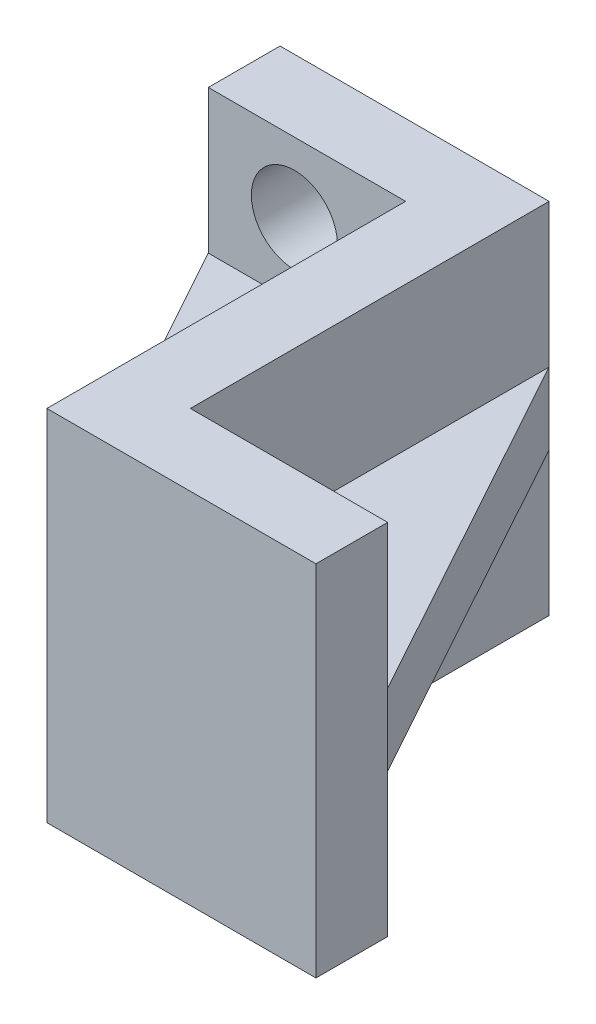
ISO-10303-21;
HEADER;
FILE_DESCRIPTION(('STEP AP214'),'2;1');
FILE_NAME('part.step','',(''),(''),'','','');
FILE_SCHEMA(('AUTOMOTIVE_DESIGN { 1 0 10303 214 1 1 1 1 }'));
ENDSEC;
DATA;
#1=APPLICATION_CONTEXT('core data for automotive mechanical design processes');
#2=APPLICATION_PROTOCOL_DEFINITION('international standard','automotive_design',2000,#1);
#3=PRODUCT_CONTEXT('',#1,'mechanical');
#4=PRODUCT('Part','Part','',(#3));
#5=PRODUCT_RELATED_PRODUCT_CATEGORY('part','',(#4));
#6=PRODUCT_DEFINITION_FORMATION('','',#4);
#7=PRODUCT_DEFINITION_CONTEXT('part definition',#1,'design');
#8=PRODUCT_DEFINITION('design','',#6,#7);
#9=PRODUCT_DEFINITION_SHAPE('','',#8);
#10=(LENGTH_UNIT() NAMED_UNIT(*) SI_UNIT(.MILLI.,.METRE.));
#11=(NAMED_UNIT(*) PLANE_ANGLE_UNIT() SI_UNIT($,.RADIAN.));
#12=(NAMED_UNIT(*) SI_UNIT($,.STERADIAN.) SOLID_ANGLE_UNIT());
#13=UNCERTAINTY_MEASURE_WITH_UNIT(LENGTH_MEASURE(1.E-05),#10,'distance_accuracy_value','');
#14=(GEOMETRIC_REPRESENTATION_CONTEXT(3) GLOBAL_UNCERTAINTY_ASSIGNED_CONTEXT((#13)) GLOBAL_UNIT_ASSIGNED_CONTEXT((#10,
#11,#12)) REPRESENTATION_CONTEXT('',''));
#15=CARTESIAN_POINT('',(0.,0.,0.));
#16=DIRECTION('',(0.,0.,1.));
#17=DIRECTION('',(1.,0.,0.));
#18=AXIS2_PLACEMENT_3D('',#15,#16,#17);
#19=CARTESIAN_POINT('',(-20.,0.,0.));
#20=DIRECTION('',(1.,0.,0.));
#21=DIRECTION('',(0.,0.,-1.));
#22=AXIS2_PLACEMENT_3D('',#19,#20,#21);
#23=PLANE('',#22);
#24=DIRECTION('',(0.,0.,1.));
#25=VECTOR('',#24,1.);
#26=CARTESIAN_POINT('',(-20.,-20.,0.));
#27=LINE('',#26,#25);
#28=CARTESIAN_POINT('',(-20.,-20.,-80.));
#29=VERTEX_POINT('',#28);
#30=CARTESIAN_POINT('',(-20.,-20.,120.));
#31=VERTEX_POINT('',#30);
#32=EDGE_CURVE('E141',#29,#31,#27,.T.);
#33=ORIENTED_EDGE('',*,*,#32,.F.);
#34=DIRECTION('',(0.,1.,0.));
#35=VECTOR('',#34,1.);
#36=CARTESIAN_POINT('',(-20.,100.,-80.));
#37=LINE('',#36,#35);
#38=CARTESIAN_POINT('',(-20.,-100.,-80.));
#39=VERTEX_POINT('',#38);
#40=EDGE_CURVE('E199',#39,#29,#37,.T.);
#41=ORIENTED_EDGE('',*,*,#40,.F.);
#42=DIRECTION('',(0.,0.,-1.));
#43=VECTOR('',#42,1.);
#44=CARTESIAN_POINT('',(-20.,-100.,120.));
#45=LINE('',#44,#43);
#46=CARTESIAN_POINT('',(-20.,-100.,120.));
#47=VERTEX_POINT('',#46);
#48=EDGE_CURVE('E161',#47,#39,#45,.T.);
#49=ORIENTED_EDGE('',*,*,#48,.F.);
#50=DIRECTION('',(0.,-1.,0.));
#51=VECTOR('',#50,1.);
#52=CARTESIAN_POINT('',(-20.,-100.,120.));
#53=LINE('',#52,#51);
#54=EDGE_CURVE('E159',#31,#47,#53,.T.);
#55=ORIENTED_EDGE('',*,*,#54,.F.);
#56=EDGE_LOOP('',(#33,#41,#49,#55));
#57=FACE_BOUND('',#56,.T.);
#58=ADVANCED_FACE('F39',(#57),#23,.F.);
#59=CARTESIAN_POINT('',(-130.,100.,-80.));
#60=DIRECTION('',(0.,0.,-1.));
#61=DIRECTION('',(-1.,0.,0.));
#62=AXIS2_PLACEMENT_3D('',#59,#60,#61);
#63=PLANE('',#62);
#64=CARTESIAN_POINT('',(-82.,-60.,-80.));
#65=DIRECTION('',(0.,0.,-1.));
#66=DIRECTION('',(-1.,0.,0.));
#67=AXIS2_PLACEMENT_3D('',#64,#65,#66);
#68=CIRCLE('',#67,24.);
#69=CARTESIAN_POINT('',(-106.,-60.,-80.));
#70=VERTEX_POINT('',#69);
#71=EDGE_CURVE('E156',#70,#70,#68,.T.);
#72=ORIENTED_EDGE('',*,*,#71,.T.);
#73=EDGE_LOOP('',(#72));
#74=FACE_BOUND('',#73,.T.);
#75=DIRECTION('',(1.,0.,0.));
#76=VECTOR('',#75,1.);
#77=CARTESIAN_POINT('',(-130.,-20.,-80.));
#78=LINE('',#77,#76);
#79=CARTESIAN_POINT('',(-130.,-20.,-80.));
#80=VERTEX_POINT('',#79);
#81=EDGE_CURVE('E146',#80,#29,#78,.T.);
#82=ORIENTED_EDGE('',*,*,#81,.F.);
#83=DIRECTION('',(0.,1.,0.));
#84=VECTOR('',#83,1.);
#85=CARTESIAN_POINT('',(-130.,100.,-80.));
#86=LINE('',#85,#84);
#87=CARTESIAN_POINT('',(-130.,-100.,-80.));
#88=VERTEX_POINT('',#87);
#89=EDGE_CURVE('E204',#88,#80,#86,.T.);
#90=ORIENTED_EDGE('',*,*,#89,.F.);
#91=DIRECTION('',(1.,0.,0.));
#92=VECTOR('',#91,1.);
#93=CARTESIAN_POINT('',(-130.,-100.,-80.));
#94=LINE('',#93,#92);
#95=EDGE_CURVE('E211',#88,#39,#94,.T.);
#96=ORIENTED_EDGE('',*,*,#95,.T.);
#97=ORIENTED_EDGE('',*,*,#40,.T.);
#98=EDGE_LOOP('',(#82,#90,#96,#97));
#99=FACE_BOUND('',#98,.T.);
#100=ADVANCED_FACE('F309',(#74,#99),#63,.F.);
#101=CARTESIAN_POINT('',(20.,0.,0.));
#102=DIRECTION('',(1.,0.,0.));
#103=DIRECTION('',(0.,0.,-1.));
#104=AXIS2_PLACEMENT_3D('',#101,#102,#103);
#105=PLANE('',#104);
#106=DIRECTION('',(0.,1.,0.));
#107=VECTOR('',#106,1.);
#108=CARTESIAN_POINT('',(20.,-100.,-120.));
#109=LINE('',#108,#107);
#110=CARTESIAN_POINT('',(20.,-100.,-120.));
#111=VERTEX_POINT('',#110);
#112=CARTESIAN_POINT('',(20.,-20.,-120.));
#113=VERTEX_POINT('',#112);
#114=EDGE_CURVE('E243',#111,#113,#109,.T.);
#115=ORIENTED_EDGE('',*,*,#114,.T.);
#116=DIRECTION('',(0.,0.,1.));
#117=VECTOR('',#116,1.);
#118=CARTESIAN_POINT('',(20.,-20.,0.));
#119=LINE('',#118,#117);
#120=CARTESIAN_POINT('',(20.,-20.,80.));
#121=VERTEX_POINT('',#120);
#122=EDGE_CURVE('E181',#113,#121,#119,.T.);
#123=ORIENTED_EDGE('',*,*,#122,.T.);
#124=DIRECTION('',(0.,1.,0.));
#125=VECTOR('',#124,1.);
#126=CARTESIAN_POINT('',(20.,-100.,80.));
#127=LINE('',#126,#125);
#128=CARTESIAN_POINT('',(20.,-100.,80.));
#129=VERTEX_POINT('',#128);
#130=EDGE_CURVE('E219',#129,#121,#127,.T.);
#131=ORIENTED_EDGE('',*,*,#130,.F.);
#132=DIRECTION('',(0.,0.,-1.));
#133=VECTOR('',#132,1.);
#134=CARTESIAN_POINT('',(20.,-100.,120.));
#135=LINE('',#134,#133);
#136=EDGE_CURVE('E240',#129,#111,#135,.T.);
#137=ORIENTED_EDGE('',*,*,#136,.T.);
#138=EDGE_LOOP('',(#115,#123,#131,#137));
#139=FACE_BOUND('',#138,.T.);
#140=ADVANCED_FACE('F316',(#139),#105,.T.);
#141=CARTESIAN_POINT('',(130.,-100.,80.));
#142=DIRECTION('',(0.,0.,1.));
#143=DIRECTION('',(1.,0.,0.));
#144=AXIS2_PLACEMENT_3D('',#141,#142,#143);
#145=PLANE('',#144);
#146=DIRECTION('',(-1.,0.,0.));
#147=VECTOR('',#146,1.);
#148=CARTESIAN_POINT('',(130.,-20.,80.));
#149=LINE('',#148,#147);
#150=CARTESIAN_POINT('',(130.,-20.,80.));
#151=VERTEX_POINT('',#150);
#152=EDGE_CURVE('E185',#151,#121,#149,.T.);
#153=ORIENTED_EDGE('',*,*,#152,.F.);
#154=DIRECTION('',(0.,1.,0.));
#155=VECTOR('',#154,1.);
#156=CARTESIAN_POINT('',(130.,-100.,80.));
#157=LINE('',#156,#155);
#158=CARTESIAN_POINT('',(130.,-100.,80.));
#159=VERTEX_POINT('',#158);
#160=EDGE_CURVE('E220',#159,#151,#157,.T.);
#161=ORIENTED_EDGE('',*,*,#160,.F.);
#162=DIRECTION('',(-1.,0.,0.));
#163=VECTOR('',#162,1.);
#164=CARTESIAN_POINT('',(130.,-100.,80.));
#165=LINE('',#164,#163);
#166=EDGE_CURVE('E234',#159,#129,#165,.T.);
#167=ORIENTED_EDGE('',*,*,#166,.T.);
#168=ORIENTED_EDGE('',*,*,#130,.T.);
#169=EDGE_LOOP('',(#153,#161,#167,#168));
#170=FACE_BOUND('',#169,.T.);
#171=ADVANCED_FACE('F321',(#170),#145,.F.);
#172=CARTESIAN_POINT('',(-20.,20.,-80.));
#173=VERTEX_POINT('',#172);
#174=CARTESIAN_POINT('',(-20.,100.,-80.));
#175=VERTEX_POINT('',#174);
#176=EDGE_CURVE('E194',#173,#175,#37,.T.);
#177=ORIENTED_EDGE('',*,*,#176,.F.);
#178=DIRECTION('',(0.,0.,1.));
#179=VECTOR('',#178,1.);
#180=CARTESIAN_POINT('',(-20.,20.,0.));
#181=LINE('',#180,#179);
#182=CARTESIAN_POINT('',(-20.,20.,120.));
#183=VERTEX_POINT('',#182);
#184=EDGE_CURVE('E177',#173,#183,#181,.T.);
#185=ORIENTED_EDGE('',*,*,#184,.T.);
#186=CARTESIAN_POINT('',(-20.,100.,120.));
#187=VERTEX_POINT('',#186);
#188=EDGE_CURVE('E165',#187,#183,#53,.T.);
#189=ORIENTED_EDGE('',*,*,#188,.F.);
#190=DIRECTION('',(0.,0.,1.));
#191=VECTOR('',#190,1.);
#192=CARTESIAN_POINT('',(-20.,100.,120.));
#193=LINE('',#192,#191);
#194=EDGE_CURVE('E166',#175,#187,#193,.T.);
#195=ORIENTED_EDGE('',*,*,#194,.F.);
#196=EDGE_LOOP('',(#177,#185,#189,#195));
#197=FACE_BOUND('',#196,.T.);
#198=ADVANCED_FACE('F273',(#197),#23,.F.);
#199=CARTESIAN_POINT('',(20.,100.,120.));
#200=DIRECTION('',(0.,-1.,0.));
#201=DIRECTION('',(0.,0.,-1.));
#202=AXIS2_PLACEMENT_3D('',#199,#200,#201);
#203=PLANE('',#202);
#204=DIRECTION('',(-1.,0.,0.));
#205=VECTOR('',#204,1.);
#206=CARTESIAN_POINT('',(20.,100.,-120.));
#207=LINE('',#206,#205);
#208=CARTESIAN_POINT('',(20.,100.,-120.));
#209=VERTEX_POINT('',#208);
#210=CARTESIAN_POINT('',(-130.,100.,-120.));
#211=VERTEX_POINT('',#210);
#212=EDGE_CURVE('E246',#209,#211,#207,.T.);
#213=ORIENTED_EDGE('',*,*,#212,.T.);
#214=DIRECTION('',(0.,0.,-1.));
#215=VECTOR('',#214,1.);
#216=CARTESIAN_POINT('',(-130.,100.,-120.));
#217=LINE('',#216,#215);
#218=CARTESIAN_POINT('',(-130.,100.,-80.));
#219=VERTEX_POINT('',#218);
#220=EDGE_CURVE('E195',#219,#211,#217,.T.);
#221=ORIENTED_EDGE('',*,*,#220,.F.);
#222=DIRECTION('',(1.,0.,0.));
#223=VECTOR('',#222,1.);
#224=CARTESIAN_POINT('',(-130.,100.,-80.));
#225=LINE('',#224,#223);
#226=EDGE_CURVE('E207',#219,#175,#225,.T.);
#227=ORIENTED_EDGE('',*,*,#226,.T.);
#228=ORIENTED_EDGE('',*,*,#194,.T.);
#229=DIRECTION('',(-1.,0.,0.));
#230=VECTOR('',#229,1.);
#231=CARTESIAN_POINT('',(20.,100.,120.));
#232=LINE('',#231,#230);
#233=CARTESIAN_POINT('',(130.,100.,120.));
#234=VERTEX_POINT('',#233);
#235=EDGE_CURVE('E11',#234,#187,#232,.T.);
#236=ORIENTED_EDGE('',*,*,#235,.F.);
#237=DIRECTION('',(0.,0.,1.));
#238=VECTOR('',#237,1.);
#239=CARTESIAN_POINT('',(130.,100.,120.));
#240=LINE('',#239,#238);
#241=CARTESIAN_POINT('',(130.,100.,80.));
#242=VERTEX_POINT('',#241);
#243=EDGE_CURVE('E223',#242,#234,#240,.T.);
#244=ORIENTED_EDGE('',*,*,#243,.F.);
#245=DIRECTION('',(-1.,0.,0.));
#246=VECTOR('',#245,1.);
#247=CARTESIAN_POINT('',(130.,100.,80.));
#248=LINE('',#247,#246);
#249=CARTESIAN_POINT('',(20.,100.,80.));
#250=VERTEX_POINT('',#249);
#251=EDGE_CURVE('E229',#242,#250,#248,.T.);
#252=ORIENTED_EDGE('',*,*,#251,.T.);
#253=DIRECTION('',(0.,0.,1.));
#254=VECTOR('',#253,1.);
#255=CARTESIAN_POINT('',(20.,100.,120.));
#256=LINE('',#255,#254);
#257=EDGE_CURVE('E237',#209,#250,#256,.T.);
#258=ORIENTED_EDGE('',*,*,#257,.F.);
#259=EDGE_LOOP('',(#213,#221,#227,#228,#236,#244,#252,#258));
#260=FACE_BOUND('',#259,.T.);
#261=ADVANCED_FACE('F41',(#260),#203,.F.);
#262=CARTESIAN_POINT('',(20.,-100.,120.));
#263=DIRECTION('',(0.,0.,-1.));
#264=DIRECTION('',(-1.,0.,0.));
#265=AXIS2_PLACEMENT_3D('',#262,#263,#264);
#266=PLANE('',#265);
#267=ORIENTED_EDGE('',*,*,#188,.T.);
#268=DIRECTION('',(0.,-1.,0.));
#269=VECTOR('',#268,1.);
#270=CARTESIAN_POINT('',(-20.,-100.,120.));
#271=LINE('',#270,#269);
#272=EDGE_CURVE('E153',#31,#183,#271,.F.);
#273=ORIENTED_EDGE('',*,*,#272,.F.);
#274=ORIENTED_EDGE('',*,*,#54,.T.);
#275=DIRECTION('',(-1.,0.,0.));
#276=VECTOR('',#275,1.);
#277=CARTESIAN_POINT('',(20.,-100.,120.));
#278=LINE('',#277,#276);
#279=CARTESIAN_POINT('',(130.,-100.,120.));
#280=VERTEX_POINT('',#279);
#281=EDGE_CURVE('E48',#280,#47,#278,.T.);
#282=ORIENTED_EDGE('',*,*,#281,.F.);
#283=DIRECTION('',(0.,-1.,0.));
#284=VECTOR('',#283,1.);
#285=CARTESIAN_POINT('',(130.,-100.,120.));
#286=LINE('',#285,#284);
#287=EDGE_CURVE('E227',#234,#280,#286,.T.);
#288=ORIENTED_EDGE('',*,*,#287,.F.);
#289=ORIENTED_EDGE('',*,*,#235,.T.);
#290=EDGE_LOOP('',(#267,#273,#274,#282,#288,#289));
#291=FACE_BOUND('',#290,.T.);
#292=ADVANCED_FACE('F169',(#291),#266,.F.);
#293=CARTESIAN_POINT('',(20.,-100.,120.));
#294=DIRECTION('',(0.,1.,0.));
#295=DIRECTION('',(0.,0.,1.));
#296=AXIS2_PLACEMENT_3D('',#293,#294,#295);
#297=PLANE('',#296);
#298=ORIENTED_EDGE('',*,*,#48,.T.);
#299=ORIENTED_EDGE('',*,*,#95,.F.);
#300=DIRECTION('',(0.,0.,1.));
#301=VECTOR('',#300,1.);
#302=CARTESIAN_POINT('',(-130.,-100.,-120.));
#303=LINE('',#302,#301);
#304=CARTESIAN_POINT('',(-130.,-100.,-120.));
#305=VERTEX_POINT('',#304);
#306=EDGE_CURVE('E201',#305,#88,#303,.T.);
#307=ORIENTED_EDGE('',*,*,#306,.F.);
#308=DIRECTION('',(-1.,0.,0.));
#309=VECTOR('',#308,1.);
#310=CARTESIAN_POINT('',(20.,-100.,-120.));
#311=LINE('',#310,#309);
#312=EDGE_CURVE('E250',#111,#305,#311,.T.);
#313=ORIENTED_EDGE('',*,*,#312,.F.);
#314=ORIENTED_EDGE('',*,*,#136,.F.);
#315=ORIENTED_EDGE('',*,*,#166,.F.);
#316=DIRECTION('',(0.,0.,-1.));
#317=VECTOR('',#316,1.);
#318=CARTESIAN_POINT('',(130.,-100.,120.));
#319=LINE('',#318,#317);
#320=EDGE_CURVE('E215',#280,#159,#319,.T.);
#321=ORIENTED_EDGE('',*,*,#320,.F.);
#322=ORIENTED_EDGE('',*,*,#281,.T.);
#323=EDGE_LOOP('',(#298,#299,#307,#313,#314,#315,#321,#322));
#324=FACE_BOUND('',#323,.T.);
#325=ADVANCED_FACE('F255',(#324),#297,.F.);
#326=CARTESIAN_POINT('',(20.,-100.,-120.));
#327=DIRECTION('',(0.,0.,1.));
#328=DIRECTION('',(1.,0.,0.));
#329=AXIS2_PLACEMENT_3D('',#326,#327,#328);
#330=PLANE('',#329);
#331=CARTESIAN_POINT('',(-82.,-60.,-120.));
#332=DIRECTION('',(0.,0.,1.));
#333=DIRECTION('',(1.,0.,0.));
#334=AXIS2_PLACEMENT_3D('',#331,#332,#333);
#335=CIRCLE('',#334,24.);
#336=CARTESIAN_POINT('',(-58.,-60.,-120.));
#337=VERTEX_POINT('',#336);
#338=EDGE_CURVE('E283',#337,#337,#335,.T.);
#339=ORIENTED_EDGE('',*,*,#338,.T.);
#340=EDGE_LOOP('',(#339));
#341=FACE_BOUND('',#340,.T.);
#342=CARTESIAN_POINT('',(-82.,60.,-120.));
#343=DIRECTION('',(0.,0.,1.));
#344=DIRECTION('',(-1.,0.,0.));
#345=AXIS2_PLACEMENT_3D('',#342,#343,#344);
#346=CIRCLE('',#345,24.);
#347=CARTESIAN_POINT('',(-106.,60.,-120.));
#348=VERTEX_POINT('',#347);
#349=EDGE_CURVE('E280',#348,#348,#346,.T.);
#350=ORIENTED_EDGE('',*,*,#349,.T.);
#351=EDGE_LOOP('',(#350));
#352=FACE_BOUND('',#351,.T.);
#353=CARTESIAN_POINT('',(20.,20.,-120.));
#354=VERTEX_POINT('',#353);
#355=EDGE_CURVE('E242',#354,#209,#109,.T.);
#356=ORIENTED_EDGE('',*,*,#355,.F.);
#357=DIRECTION('',(0.,1.,0.));
#358=VECTOR('',#357,1.);
#359=CARTESIAN_POINT('',(20.,0.,-120.));
#360=LINE('',#359,#358);
#361=EDGE_CURVE('E192',#113,#354,#360,.T.);
#362=ORIENTED_EDGE('',*,*,#361,.F.);
#363=ORIENTED_EDGE('',*,*,#114,.F.);
#364=ORIENTED_EDGE('',*,*,#312,.T.);
#365=DIRECTION('',(0.,-1.,0.));
#366=VECTOR('',#365,1.);
#367=CARTESIAN_POINT('',(-130.,100.,-120.));
#368=LINE('',#367,#366);
#369=EDGE_CURVE('E198',#211,#305,#368,.T.);
#370=ORIENTED_EDGE('',*,*,#369,.F.);
#371=ORIENTED_EDGE('',*,*,#212,.F.);
#372=EDGE_LOOP('',(#356,#362,#363,#364,#370,#371));
#373=FACE_BOUND('',#372,.T.);
#374=ADVANCED_FACE('F344',(#341,#352,#373),#330,.F.);
#375=DIRECTION('',(0.,0.,1.));
#376=VECTOR('',#375,1.);
#377=CARTESIAN_POINT('',(20.,20.,0.));
#378=LINE('',#377,#376);
#379=CARTESIAN_POINT('',(20.,20.,80.));
#380=VERTEX_POINT('',#379);
#381=EDGE_CURVE('E187',#354,#380,#378,.T.);
#382=ORIENTED_EDGE('',*,*,#381,.F.);
#383=ORIENTED_EDGE('',*,*,#355,.T.);
#384=ORIENTED_EDGE('',*,*,#257,.T.);
#385=EDGE_CURVE('E214',#380,#250,#127,.T.);
#386=ORIENTED_EDGE('',*,*,#385,.F.);
#387=EDGE_LOOP('',(#382,#383,#384,#386));
#388=FACE_BOUND('',#387,.T.);
#389=ADVANCED_FACE('F335',(#388),#105,.T.);
#390=CARTESIAN_POINT('',(130.,20.,80.));
#391=VERTEX_POINT('',#390);
#392=EDGE_CURVE('E218',#391,#242,#157,.T.);
#393=ORIENTED_EDGE('',*,*,#392,.F.);
#394=DIRECTION('',(-1.,0.,0.));
#395=VECTOR('',#394,1.);
#396=CARTESIAN_POINT('',(130.,20.,80.));
#397=LINE('',#396,#395);
#398=EDGE_CURVE('E189',#391,#380,#397,.T.);
#399=ORIENTED_EDGE('',*,*,#398,.T.);
#400=ORIENTED_EDGE('',*,*,#385,.T.);
#401=ORIENTED_EDGE('',*,*,#251,.F.);
#402=EDGE_LOOP('',(#393,#399,#400,#401));
#403=FACE_BOUND('',#402,.T.);
#404=ADVANCED_FACE('F329',(#403),#145,.F.);
#405=CARTESIAN_POINT('',(130.,0.,0.));
#406=DIRECTION('',(1.,0.,0.));
#407=DIRECTION('',(0.,0.,-1.));
#408=AXIS2_PLACEMENT_3D('',#405,#406,#407);
#409=PLANE('',#408);
#410=ORIENTED_EDGE('',*,*,#287,.T.);
#411=ORIENTED_EDGE('',*,*,#320,.T.);
#412=ORIENTED_EDGE('',*,*,#160,.T.);
#413=EDGE_CURVE('E224',#151,#391,#157,.T.);
#414=ORIENTED_EDGE('',*,*,#413,.T.);
#415=ORIENTED_EDGE('',*,*,#392,.T.);
#416=ORIENTED_EDGE('',*,*,#243,.T.);
#417=EDGE_LOOP('',(#410,#411,#412,#414,#415,#416));
#418=FACE_BOUND('',#417,.T.);
#419=ADVANCED_FACE('F260',(#418),#409,.T.);
#420=CARTESIAN_POINT('',(-82.,60.,-80.));
#421=DIRECTION('',(0.,0.,-1.));
#422=DIRECTION('',(-1.,0.,0.));
#423=AXIS2_PLACEMENT_3D('',#420,#421,#422);
#424=CIRCLE('',#423,24.);
#425=CARTESIAN_POINT('',(-106.,60.,-80.));
#426=VERTEX_POINT('',#425);
#427=EDGE_CURVE('E43',#426,#426,#424,.T.);
#428=ORIENTED_EDGE('',*,*,#427,.T.);
#429=EDGE_LOOP('',(#428));
#430=FACE_BOUND('',#429,.T.);
#431=CARTESIAN_POINT('',(-130.,20.,-80.));
#432=VERTEX_POINT('',#431);
#433=EDGE_CURVE('E203',#432,#219,#86,.T.);
#434=ORIENTED_EDGE('',*,*,#433,.F.);
#435=DIRECTION('',(1.,0.,0.));
#436=VECTOR('',#435,1.);
#437=CARTESIAN_POINT('',(-130.,20.,-80.));
#438=LINE('',#437,#436);
#439=EDGE_CURVE('E172',#432,#173,#438,.T.);
#440=ORIENTED_EDGE('',*,*,#439,.T.);
#441=ORIENTED_EDGE('',*,*,#176,.T.);
#442=ORIENTED_EDGE('',*,*,#226,.F.);
#443=EDGE_LOOP('',(#434,#440,#441,#442));
#444=FACE_BOUND('',#443,.T.);
#445=ADVANCED_FACE('F290',(#430,#444),#63,.F.);
#446=CARTESIAN_POINT('',(-130.,0.,0.));
#447=DIRECTION('',(1.,0.,0.));
#448=DIRECTION('',(0.,0.,-1.));
#449=AXIS2_PLACEMENT_3D('',#446,#447,#448);
#450=PLANE('',#449);
#451=ORIENTED_EDGE('',*,*,#369,.T.);
#452=ORIENTED_EDGE('',*,*,#306,.T.);
#453=ORIENTED_EDGE('',*,*,#89,.T.);
#454=EDGE_CURVE('E155',#80,#432,#86,.T.);
#455=ORIENTED_EDGE('',*,*,#454,.T.);
#456=ORIENTED_EDGE('',*,*,#433,.T.);
#457=ORIENTED_EDGE('',*,*,#220,.T.);
#458=EDGE_LOOP('',(#451,#452,#453,#455,#456,#457));
#459=FACE_BOUND('',#458,.T.);
#460=ADVANCED_FACE('F364',(#459),#450,.F.);
#461=CARTESIAN_POINT('',(130.,0.,80.));
#462=DIRECTION('',(0.876215908676647,0.,-0.481918749772156));
#463=DIRECTION('',(-0.481918749772156,0.,-0.876215908676647));
#464=AXIS2_PLACEMENT_3D('',#461,#462,#463);
#465=PLANE('',#464);
#466=DIRECTION('',(-0.481918749772156,0.,-0.876215908676647));
#467=VECTOR('',#466,1.);
#468=CARTESIAN_POINT('',(130.,-20.,80.));
#469=LINE('',#468,#467);
#470=EDGE_CURVE('E171',#151,#113,#469,.T.);
#471=ORIENTED_EDGE('',*,*,#470,.T.);
#472=ORIENTED_EDGE('',*,*,#361,.T.);
#473=DIRECTION('',(-0.481918749772156,0.,-0.876215908676647));
#474=VECTOR('',#473,1.);
#475=CARTESIAN_POINT('',(130.,20.,80.));
#476=LINE('',#475,#474);
#477=EDGE_CURVE('E63',#391,#354,#476,.T.);
#478=ORIENTED_EDGE('',*,*,#477,.F.);
#479=ORIENTED_EDGE('',*,*,#413,.F.);
#480=EDGE_LOOP('',(#471,#472,#478,#479));
#481=FACE_BOUND('',#480,.T.);
#482=ADVANCED_FACE('F348',(#481),#465,.T.);
#483=CARTESIAN_POINT('',(0.,20.,0.));
#484=DIRECTION('',(0.,1.,0.));
#485=DIRECTION('',(0.,0.,1.));
#486=AXIS2_PLACEMENT_3D('',#483,#484,#485);
#487=PLANE('',#486);
#488=ORIENTED_EDGE('',*,*,#398,.F.);
#489=ORIENTED_EDGE('',*,*,#477,.T.);
#490=ORIENTED_EDGE('',*,*,#381,.T.);
#491=EDGE_LOOP('',(#488,#489,#490));
#492=FACE_BOUND('',#491,.T.);
#493=ADVANCED_FACE('F362',(#492),#487,.T.);
#494=CARTESIAN_POINT('',(0.,-20.,0.));
#495=DIRECTION('',(0.,1.,0.));
#496=DIRECTION('',(0.,0.,1.));
#497=AXIS2_PLACEMENT_3D('',#494,#495,#496);
#498=PLANE('',#497);
#499=ORIENTED_EDGE('',*,*,#470,.F.);
#500=ORIENTED_EDGE('',*,*,#152,.T.);
#501=ORIENTED_EDGE('',*,*,#122,.F.);
#502=EDGE_LOOP('',(#499,#500,#501));
#503=FACE_BOUND('',#502,.T.);
#504=ADVANCED_FACE('F351',(#503),#498,.F.);
#505=CARTESIAN_POINT('',(0.,20.,0.));
#506=DIRECTION('',(0.,1.,0.));
#507=DIRECTION('',(0.,0.,1.));
#508=AXIS2_PLACEMENT_3D('',#505,#506,#507);
#509=PLANE('',#508);
#510=ORIENTED_EDGE('',*,*,#439,.F.);
#511=DIRECTION('',(-0.481918749772156,0.,-0.876215908676647));
#512=VECTOR('',#511,1.);
#513=CARTESIAN_POINT('',(-20.,20.,120.));
#514=LINE('',#513,#512);
#515=EDGE_CURVE('E55',#183,#432,#514,.T.);
#516=ORIENTED_EDGE('',*,*,#515,.F.);
#517=ORIENTED_EDGE('',*,*,#184,.F.);
#518=EDGE_LOOP('',(#510,#516,#517));
#519=FACE_BOUND('',#518,.T.);
#520=ADVANCED_FACE('F366',(#519),#509,.T.);
#521=CARTESIAN_POINT('',(0.,-20.,0.));
#522=DIRECTION('',(0.,1.,0.));
#523=DIRECTION('',(0.,0.,1.));
#524=AXIS2_PLACEMENT_3D('',#521,#522,#523);
#525=PLANE('',#524);
#526=DIRECTION('',(-0.481918749772156,0.,-0.876215908676647));
#527=VECTOR('',#526,1.);
#528=CARTESIAN_POINT('',(-20.,-20.,120.));
#529=LINE('',#528,#527);
#530=EDGE_CURVE('E144',#31,#80,#529,.T.);
#531=ORIENTED_EDGE('',*,*,#530,.T.);
#532=ORIENTED_EDGE('',*,*,#81,.T.);
#533=ORIENTED_EDGE('',*,*,#32,.T.);
#534=EDGE_LOOP('',(#531,#532,#533));
#535=FACE_BOUND('',#534,.T.);
#536=ADVANCED_FACE('F143',(#535),#525,.F.);
#537=CARTESIAN_POINT('',(-20.,0.,120.));
#538=DIRECTION('',(0.876215908676647,0.,-0.481918749772156));
#539=DIRECTION('',(-0.481918749772156,0.,-0.876215908676647));
#540=AXIS2_PLACEMENT_3D('',#537,#538,#539);
#541=PLANE('',#540);
#542=ORIENTED_EDGE('',*,*,#530,.F.);
#543=ORIENTED_EDGE('',*,*,#272,.T.);
#544=ORIENTED_EDGE('',*,*,#515,.T.);
#545=ORIENTED_EDGE('',*,*,#454,.F.);
#546=EDGE_LOOP('',(#542,#543,#544,#545));
#547=FACE_BOUND('',#546,.T.);
#548=ADVANCED_FACE('F151',(#547),#541,.F.);
#549=CARTESIAN_POINT('',(-82.,60.,-120.));
#550=DIRECTION('',(0.,0.,1.));
#551=DIRECTION('',(1.,0.,0.));
#552=AXIS2_PLACEMENT_3D('',#549,#550,#551);
#553=CYLINDRICAL_SURFACE('',#552,24.);
#554=ORIENTED_EDGE('',*,*,#349,.F.);
#555=EDGE_LOOP('',(#554));
#556=FACE_BOUND('',#555,.T.);
#557=ORIENTED_EDGE('',*,*,#427,.F.);
#558=EDGE_LOOP('',(#557));
#559=FACE_BOUND('',#558,.T.);
#560=ADVANCED_FACE('F293',(#556,#559),#553,.F.);
#561=CARTESIAN_POINT('',(-82.,-60.,-120.));
#562=DIRECTION('',(0.,0.,1.));
#563=DIRECTION('',(1.,0.,0.));
#564=AXIS2_PLACEMENT_3D('',#561,#562,#563);
#565=CYLINDRICAL_SURFACE('',#564,24.);
#566=ORIENTED_EDGE('',*,*,#338,.F.);
#567=EDGE_LOOP('',(#566));
#568=FACE_BOUND('',#567,.T.);
#569=ORIENTED_EDGE('',*,*,#71,.F.);
#570=EDGE_LOOP('',(#569));
#571=FACE_BOUND('',#570,.T.);
#572=ADVANCED_FACE('F295',(#568,#571),#565,.F.);
#573=CLOSED_SHELL('',(#58,#100,#140,#171,#198,#261,#292,#325,#374,#389,#404,#419,#445,#460,#482,
#493,#504,#520,#536,#548,#560,#572));
#574=MANIFOLD_SOLID_BREP('B2',#573);
#575=ADVANCED_BREP_SHAPE_REPRESENTATION('',(#18,#574),#14);
#576=SHAPE_DEFINITION_REPRESENTATION(#9,#575);
ENDSEC;
END-ISO-10303-21;
